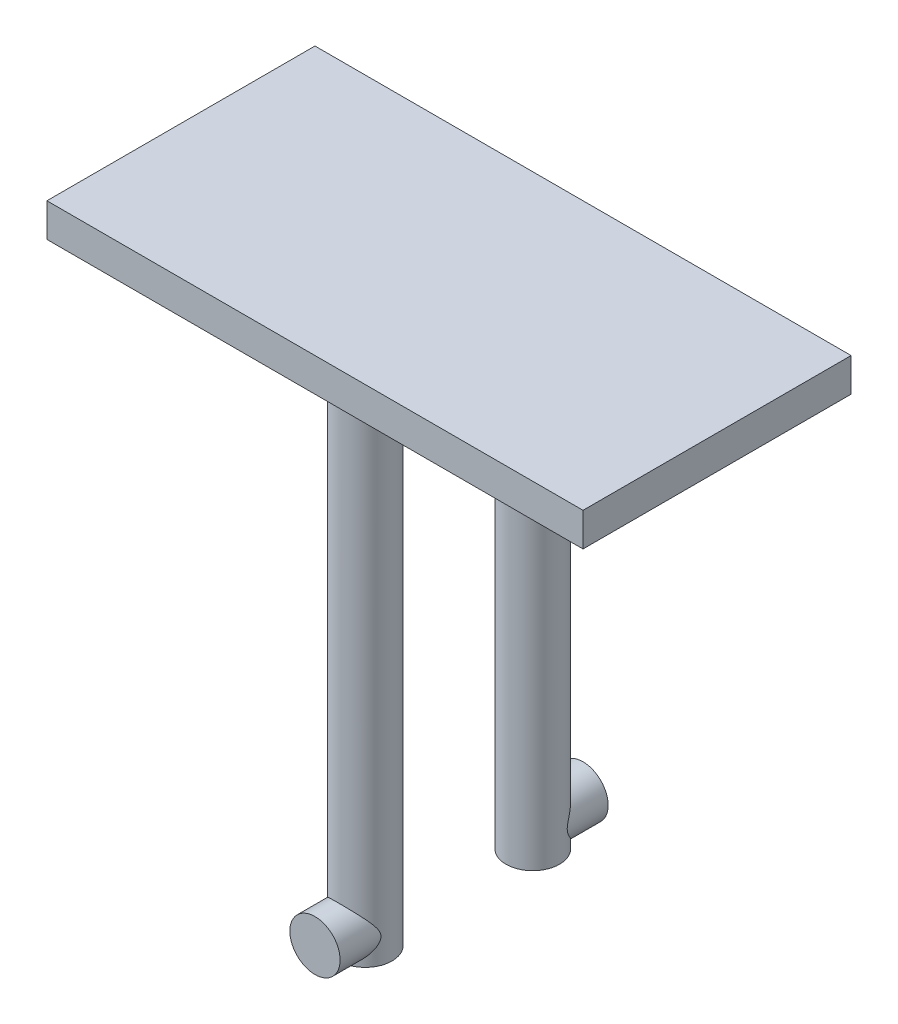
ISO-10303-21;
HEADER;
FILE_DESCRIPTION(('STEP AP214'),'2;1');
FILE_NAME('part.step','',(''),(''),'','','');
FILE_SCHEMA(('AUTOMOTIVE_DESIGN { 1 0 10303 214 1 1 1 1 }'));
ENDSEC;
DATA;
#1=APPLICATION_CONTEXT('core data for automotive mechanical design processes');
#2=APPLICATION_PROTOCOL_DEFINITION('international standard','automotive_design',2000,#1);
#3=PRODUCT_CONTEXT('',#1,'mechanical');
#4=PRODUCT('Part','Part','',(#3));
#5=PRODUCT_RELATED_PRODUCT_CATEGORY('part','',(#4));
#6=PRODUCT_DEFINITION_FORMATION('','',#4);
#7=PRODUCT_DEFINITION_CONTEXT('part definition',#1,'design');
#8=PRODUCT_DEFINITION('design','',#6,#7);
#9=PRODUCT_DEFINITION_SHAPE('','',#8);
#10=(LENGTH_UNIT() NAMED_UNIT(*) SI_UNIT(.MILLI.,.METRE.));
#11=(NAMED_UNIT(*) PLANE_ANGLE_UNIT() SI_UNIT($,.RADIAN.));
#12=(NAMED_UNIT(*) SI_UNIT($,.STERADIAN.) SOLID_ANGLE_UNIT());
#13=UNCERTAINTY_MEASURE_WITH_UNIT(LENGTH_MEASURE(1.E-05),#10,'distance_accuracy_value','');
#14=(GEOMETRIC_REPRESENTATION_CONTEXT(3) GLOBAL_UNCERTAINTY_ASSIGNED_CONTEXT((#13)) GLOBAL_UNIT_ASSIGNED_CONTEXT((#10,
#11,#12)) REPRESENTATION_CONTEXT('',''));
#15=CARTESIAN_POINT('',(0.,0.,0.));
#16=DIRECTION('',(0.,0.,1.));
#17=DIRECTION('',(1.,0.,0.));
#18=AXIS2_PLACEMENT_3D('',#15,#16,#17);
#19=CARTESIAN_POINT('',(80.,10.,-40.));
#20=DIRECTION('',(-1.,0.,0.));
#21=DIRECTION('',(0.,0.,1.));
#22=AXIS2_PLACEMENT_3D('',#19,#20,#21);
#23=PLANE('',#22);
#24=DIRECTION('',(0.,0.,-1.));
#25=VECTOR('',#24,1.);
#26=CARTESIAN_POINT('',(80.,0.,-40.));
#27=LINE('',#26,#25);
#28=CARTESIAN_POINT('',(80.,0.,40.));
#29=VERTEX_POINT('',#28);
#30=CARTESIAN_POINT('',(80.,0.,-40.));
#31=VERTEX_POINT('',#30);
#32=EDGE_CURVE('E103',#29,#31,#27,.T.);
#33=ORIENTED_EDGE('',*,*,#32,.T.);
#34=DIRECTION('',(0.,-1.,0.));
#35=VECTOR('',#34,1.);
#36=CARTESIAN_POINT('',(80.,10.,-40.));
#37=LINE('',#36,#35);
#38=CARTESIAN_POINT('',(80.,10.,-40.));
#39=VERTEX_POINT('',#38);
#40=EDGE_CURVE('E84',#39,#31,#37,.T.);
#41=ORIENTED_EDGE('',*,*,#40,.F.);
#42=DIRECTION('',(0.,0.,-1.));
#43=VECTOR('',#42,1.);
#44=CARTESIAN_POINT('',(80.,10.,-40.));
#45=LINE('',#44,#43);
#46=CARTESIAN_POINT('',(80.,10.,40.));
#47=VERTEX_POINT('',#46);
#48=EDGE_CURVE('E91',#47,#39,#45,.T.);
#49=ORIENTED_EDGE('',*,*,#48,.F.);
#50=DIRECTION('',(0.,-1.,0.));
#51=VECTOR('',#50,1.);
#52=CARTESIAN_POINT('',(80.,10.,40.));
#53=LINE('',#52,#51);
#54=EDGE_CURVE('E111',#47,#29,#53,.T.);
#55=ORIENTED_EDGE('',*,*,#54,.T.);
#56=EDGE_LOOP('',(#33,#41,#49,#55));
#57=FACE_BOUND('',#56,.T.);
#58=ADVANCED_FACE('F36',(#57),#23,.F.);
#59=CARTESIAN_POINT('',(-80.,10.,-40.));
#60=DIRECTION('',(0.,0.,1.));
#61=DIRECTION('',(1.,0.,0.));
#62=AXIS2_PLACEMENT_3D('',#59,#60,#61);
#63=PLANE('',#62);
#64=DIRECTION('',(-1.,0.,0.));
#65=VECTOR('',#64,1.);
#66=CARTESIAN_POINT('',(-80.,0.,-40.));
#67=LINE('',#66,#65);
#68=CARTESIAN_POINT('',(-80.,0.,-40.));
#69=VERTEX_POINT('',#68);
#70=EDGE_CURVE('E116',#31,#69,#67,.T.);
#71=ORIENTED_EDGE('',*,*,#70,.T.);
#72=DIRECTION('',(0.,-1.,0.));
#73=VECTOR('',#72,1.);
#74=CARTESIAN_POINT('',(-80.,10.,-40.));
#75=LINE('',#74,#73);
#76=CARTESIAN_POINT('',(-80.,10.,-40.));
#77=VERTEX_POINT('',#76);
#78=EDGE_CURVE('E87',#77,#69,#75,.T.);
#79=ORIENTED_EDGE('',*,*,#78,.F.);
#80=DIRECTION('',(-1.,0.,0.));
#81=VECTOR('',#80,1.);
#82=CARTESIAN_POINT('',(-80.,10.,-40.));
#83=LINE('',#82,#81);
#84=EDGE_CURVE('E80',#39,#77,#83,.T.);
#85=ORIENTED_EDGE('',*,*,#84,.F.);
#86=ORIENTED_EDGE('',*,*,#40,.T.);
#87=EDGE_LOOP('',(#71,#79,#85,#86));
#88=FACE_BOUND('',#87,.T.);
#89=ADVANCED_FACE('F82',(#88),#63,.F.);
#90=CARTESIAN_POINT('',(-80.,10.,-40.));
#91=DIRECTION('',(1.,0.,0.));
#92=DIRECTION('',(0.,0.,-1.));
#93=AXIS2_PLACEMENT_3D('',#90,#91,#92);
#94=PLANE('',#93);
#95=DIRECTION('',(0.,0.,1.));
#96=VECTOR('',#95,1.);
#97=CARTESIAN_POINT('',(-80.,0.,-40.));
#98=LINE('',#97,#96);
#99=CARTESIAN_POINT('',(-80.,0.,40.));
#100=VERTEX_POINT('',#99);
#101=EDGE_CURVE('E114',#69,#100,#98,.T.);
#102=ORIENTED_EDGE('',*,*,#101,.T.);
#103=DIRECTION('',(0.,-1.,0.));
#104=VECTOR('',#103,1.);
#105=CARTESIAN_POINT('',(-80.,10.,40.));
#106=LINE('',#105,#104);
#107=CARTESIAN_POINT('',(-80.,10.,40.));
#108=VERTEX_POINT('',#107);
#109=EDGE_CURVE('E106',#108,#100,#106,.T.);
#110=ORIENTED_EDGE('',*,*,#109,.F.);
#111=DIRECTION('',(0.,0.,1.));
#112=VECTOR('',#111,1.);
#113=CARTESIAN_POINT('',(-80.,10.,-40.));
#114=LINE('',#113,#112);
#115=EDGE_CURVE('E90',#77,#108,#114,.T.);
#116=ORIENTED_EDGE('',*,*,#115,.F.);
#117=ORIENTED_EDGE('',*,*,#78,.T.);
#118=EDGE_LOOP('',(#102,#110,#116,#117));
#119=FACE_BOUND('',#118,.T.);
#120=ADVANCED_FACE('F158',(#119),#94,.F.);
#121=CARTESIAN_POINT('',(-80.,10.,40.));
#122=DIRECTION('',(0.,0.,-1.));
#123=DIRECTION('',(-1.,0.,0.));
#124=AXIS2_PLACEMENT_3D('',#121,#122,#123);
#125=PLANE('',#124);
#126=DIRECTION('',(1.,0.,0.));
#127=VECTOR('',#126,1.);
#128=CARTESIAN_POINT('',(-80.,0.,40.));
#129=LINE('',#128,#127);
#130=EDGE_CURVE('E100',#100,#29,#129,.T.);
#131=ORIENTED_EDGE('',*,*,#130,.T.);
#132=ORIENTED_EDGE('',*,*,#54,.F.);
#133=DIRECTION('',(1.,0.,0.));
#134=VECTOR('',#133,1.);
#135=CARTESIAN_POINT('',(-80.,10.,40.));
#136=LINE('',#135,#134);
#137=EDGE_CURVE('E96',#108,#47,#136,.T.);
#138=ORIENTED_EDGE('',*,*,#137,.F.);
#139=ORIENTED_EDGE('',*,*,#109,.T.);
#140=EDGE_LOOP('',(#131,#132,#138,#139));
#141=FACE_BOUND('',#140,.T.);
#142=ADVANCED_FACE('F162',(#141),#125,.F.);
#143=CARTESIAN_POINT('',(0.,10.,0.));
#144=DIRECTION('',(0.,1.,0.));
#145=DIRECTION('',(0.,0.,1.));
#146=AXIS2_PLACEMENT_3D('',#143,#144,#145);
#147=PLANE('',#146);
#148=ORIENTED_EDGE('',*,*,#48,.T.);
#149=ORIENTED_EDGE('',*,*,#84,.T.);
#150=ORIENTED_EDGE('',*,*,#115,.T.);
#151=ORIENTED_EDGE('',*,*,#137,.T.);
#152=EDGE_LOOP('',(#148,#149,#150,#151));
#153=FACE_BOUND('',#152,.T.);
#154=ADVANCED_FACE('F94',(#153),#147,.T.);
#155=CARTESIAN_POINT('',(0.,0.,0.));
#156=DIRECTION('',(0.,1.,0.));
#157=DIRECTION('',(0.,0.,1.));
#158=AXIS2_PLACEMENT_3D('',#155,#156,#157);
#159=PLANE('',#158);
#160=CARTESIAN_POINT('',(0.,0.,-25.));
#161=DIRECTION('',(0.,1.,0.));
#162=DIRECTION('',(0.,0.,1.));
#163=AXIS2_PLACEMENT_3D('',#160,#161,#162);
#164=CIRCLE('',#163,8.);
#165=CARTESIAN_POINT('',(0.,0.,-17.));
#166=VERTEX_POINT('',#165);
#167=EDGE_CURVE('E11',#166,#166,#164,.F.);
#168=ORIENTED_EDGE('',*,*,#167,.F.);
#169=EDGE_LOOP('',(#168));
#170=FACE_BOUND('',#169,.T.);
#171=CARTESIAN_POINT('',(0.,0.,25.));
#172=DIRECTION('',(0.,1.,0.));
#173=DIRECTION('',(0.,0.,1.));
#174=AXIS2_PLACEMENT_3D('',#171,#172,#173);
#175=CIRCLE('',#174,8.);
#176=CARTESIAN_POINT('',(0.,0.,33.));
#177=VERTEX_POINT('',#176);
#178=EDGE_CURVE('E43',#177,#177,#175,.F.);
#179=ORIENTED_EDGE('',*,*,#178,.F.);
#180=EDGE_LOOP('',(#179));
#181=FACE_BOUND('',#180,.T.);
#182=ORIENTED_EDGE('',*,*,#32,.F.);
#183=ORIENTED_EDGE('',*,*,#130,.F.);
#184=ORIENTED_EDGE('',*,*,#101,.F.);
#185=ORIENTED_EDGE('',*,*,#70,.F.);
#186=EDGE_LOOP('',(#182,#183,#184,#185));
#187=FACE_BOUND('',#186,.T.);
#188=ADVANCED_FACE('F169',(#170,#181,#187),#159,.F.);
#189=CARTESIAN_POINT('',(0.,-150.,25.));
#190=DIRECTION('',(0.,1.,0.));
#191=DIRECTION('',(0.,0.,1.));
#192=AXIS2_PLACEMENT_3D('',#189,#190,#191);
#193=CYLINDRICAL_SURFACE('',#192,8.);
#194=CARTESIAN_POINT('',(0.,-150.,25.));
#195=DIRECTION('',(0.,-1.,0.));
#196=DIRECTION('',(0.,0.,-1.));
#197=AXIS2_PLACEMENT_3D('',#194,#195,#196);
#198=CIRCLE('',#197,8.);
#199=CARTESIAN_POINT('',(0.,-150.,33.));
#200=VERTEX_POINT('',#199);
#201=EDGE_CURVE('E119',#200,#200,#198,.T.);
#202=ORIENTED_EDGE('',*,*,#201,.F.);
#203=CARTESIAN_POINT('',(0.,-150.,33.));
#204=CARTESIAN_POINT('',(-0.171140155520825,-149.999998272119,32.9999982850458));
#205=CARTESIAN_POINT('',(-0.342347248985497,-149.994128646305,32.9944947988795));
#206=CARTESIAN_POINT('',(-0.683347114521549,-149.97076196862,32.9725948268906));
#207=CARTESIAN_POINT('',(-0.853138773025719,-149.953256502576,32.9561904583649));
#208=CARTESIAN_POINT('',(-1.19019573456619,-149.906917931642,32.912797669894));
#209=CARTESIAN_POINT('',(-1.35745443005386,-149.878059210714,32.8857853156874));
#210=CARTESIAN_POINT('',(-1.68785613707728,-149.809557463437,32.8217314698244));
#211=CARTESIAN_POINT('',(-1.85099711629617,-149.769909221368,32.7846851277169));
#212=CARTESIAN_POINT('',(-2.17079411127324,-149.68087612369,32.701605489567));
#213=CARTESIAN_POINT('',(-2.32749066541079,-149.631569313957,32.6556442575588));
#214=CARTESIAN_POINT('',(-2.63496048461638,-149.523785807643,32.5553412010213));
#215=CARTESIAN_POINT('',(-2.78573109174164,-149.4653050537,32.5009956685426));
#216=CARTESIAN_POINT('',(-3.22796304144843,-149.277362184919,32.3266923801874));
#217=CARTESIAN_POINT('',(-3.50976540960789,-149.135279252777,32.1953553051413));
#218=CARTESIAN_POINT('',(-3.96481935311031,-148.870060428321,31.9516768583423));
#219=CARTESIAN_POINT('',(-4.14547410363135,-148.753806771717,31.8452576963748));
#220=CARTESIAN_POINT('',(-4.49233053821419,-148.509485239982,31.6227908246038));
#221=CARTESIAN_POINT('',(-4.65853150542465,-148.381416779531,31.5067426377954));
#222=CARTESIAN_POINT('',(-4.97693745624539,-148.114571152028,31.266578717266));
#223=CARTESIAN_POINT('',(-5.12909618095085,-147.975761179716,31.1424384677119));
#224=CARTESIAN_POINT('',(-5.41904366538833,-147.688981938811,30.8882201087959));
#225=CARTESIAN_POINT('',(-5.5568338472138,-147.541013578962,30.7581425888972));
#226=CARTESIAN_POINT('',(-5.85378789401527,-147.195550308851,30.4579276518897));
#227=CARTESIAN_POINT('',(-6.00864552394552,-146.995488606865,30.2864750726651));
#228=CARTESIAN_POINT('',(-6.29643711950335,-146.582677935092,29.9402028423115));
#229=CARTESIAN_POINT('',(-6.42935480679956,-146.36991970305,29.7653807976505));
#230=CARTESIAN_POINT('',(-6.67335613960616,-145.932063986645,29.4171551733533));
#231=CARTESIAN_POINT('',(-6.78449331800713,-145.70699853996,29.2437491459062));
#232=CARTESIAN_POINT('',(-6.93503879605051,-145.358526639629,28.9893589413809));
#233=CARTESIAN_POINT('',(-6.98250888694929,-145.240614498295,28.9055530506312));
#234=CARTESIAN_POINT('',(-7.07200284027164,-145.000635363748,28.7410605873687));
#235=CARTESIAN_POINT('',(-7.11402765109283,-144.878569098742,28.6603734733847));
#236=CARTESIAN_POINT('',(-7.20792258104416,-144.580626070471,28.4728511713896));
#237=CARTESIAN_POINT('',(-7.25715355553096,-144.402486913328,28.3682302318375));
#238=CARTESIAN_POINT('',(-7.34370321290176,-144.034805876928,28.1750855738391));
#239=CARTESIAN_POINT('',(-7.38103501510306,-143.84527683153,28.0865441737346));
#240=CARTESIAN_POINT('',(-7.43550917073728,-143.493901098962,27.9525174289327));
#241=CARTESIAN_POINT('',(-7.45523472213531,-143.334484392454,27.9019085300405));
#242=CARTESIAN_POINT('',(-7.48447445524092,-143.009052241281,27.8256641879962));
#243=CARTESIAN_POINT('',(-7.49402079251789,-142.843059304319,27.7999501272768));
#244=CARTESIAN_POINT('',(-7.50188426137699,-142.50741481353,27.7788340177311));
#245=CARTESIAN_POINT('',(-7.50011165254644,-142.337744676994,27.7836742098476));
#246=CARTESIAN_POINT('',(-7.4853621565137,-142.002273933246,27.8230694415127));
#247=CARTESIAN_POINT('',(-7.47235945284239,-141.836483146771,27.8576929481359));
#248=CARTESIAN_POINT('',(-7.42919348555406,-141.446467526641,27.9684568284385));
#249=CARTESIAN_POINT('',(-7.39418323441422,-141.226117407615,28.0557926678811));
#250=CARTESIAN_POINT('',(-7.3081748826072,-140.800556432749,28.2561536401773));
#251=CARTESIAN_POINT('',(-7.25710620403007,-140.595417446781,28.3692915599902));
#252=CARTESIAN_POINT('',(-7.13528252726279,-140.178529357623,28.6206525540024));
#253=CARTESIAN_POINT('',(-7.0631075569353,-139.9680386822,28.7602413733488));
#254=CARTESIAN_POINT('',(-6.90268010104188,-139.558683043803,29.0472406351686));
#255=CARTESIAN_POINT('',(-6.81441141325337,-139.35983006593,29.1946588528606));
#256=CARTESIAN_POINT('',(-6.62186518229114,-138.971851462869,29.4924851778781));
#257=CARTESIAN_POINT('',(-6.5175638385451,-138.78274086688,29.6428974360643));
#258=CARTESIAN_POINT('',(-6.29291427830409,-138.413948909842,29.9431158333939));
#259=CARTESIAN_POINT('',(-6.1725721638724,-138.234263999215,30.0929221808131));
#260=CARTESIAN_POINT('',(-5.90256503866517,-137.866773481433,30.4042893110507));
#261=CARTESIAN_POINT('',(-5.75117050330106,-137.679956139813,30.5655251916551));
#262=CARTESIAN_POINT('',(-5.42785724636933,-137.318577039366,30.8812795416945));
#263=CARTESIAN_POINT('',(-5.25593182231051,-137.144019312498,31.0357957948665));
#264=CARTESIAN_POINT('',(-4.89167035945712,-136.80943504866,31.3345789133705));
#265=CARTESIAN_POINT('',(-4.69940009273921,-136.649364612557,31.4788764329711));
#266=CARTESIAN_POINT('',(-4.29384493963244,-136.345572126243,31.754473252282));
#267=CARTESIAN_POINT('',(-4.08057534190403,-136.201838343921,31.8857818710244));
#268=CARTESIAN_POINT('',(-3.71736388787438,-135.984040349336,32.0856638499816));
#269=CARTESIAN_POINT('',(-3.57369709729462,-135.904075219047,32.1592858388357));
#270=CARTESIAN_POINT('',(-3.27858166125046,-135.752526569671,32.299146850284));
#271=CARTESIAN_POINT('',(-3.12713541403125,-135.680940489545,32.3653881284777));
#272=CARTESIAN_POINT('',(-2.81689539120272,-135.547040857049,32.4895268092297));
#273=CARTESIAN_POINT('',(-2.65810216239986,-135.484726616064,32.5474248314277));
#274=CARTESIAN_POINT('',(-2.33391279425549,-135.370317156148,32.6538838848021));
#275=CARTESIAN_POINT('',(-2.16851989197029,-135.318216999719,32.7024494270813));
#276=CARTESIAN_POINT('',(-1.83051124178858,-135.224682590202,32.789734158282));
#277=CARTESIAN_POINT('',(-1.65784452477088,-135.183346813464,32.8283624009008));
#278=CARTESIAN_POINT('',(-1.30792804526106,-135.112769581755,32.8943661492893));
#279=CARTESIAN_POINT('',(-1.1306782902915,-135.083528106935,32.9217416735279));
#280=CARTESIAN_POINT('',(-0.773223557933605,-135.0377905749,32.9645781573073));
#281=CARTESIAN_POINT('',(-0.593020510230371,-135.021286509496,32.9800466029807));
#282=CARTESIAN_POINT('',(-0.231267296972528,-135.001378960833,32.9987064651965));
#283=CARTESIAN_POINT('',(-0.0497172978099028,-134.99797388556,33.0018993736723));
#284=CARTESIAN_POINT('',(0.290342268202129,-135.003939409162,32.9963069179308));
#285=CARTESIAN_POINT('',(0.448906462662995,-135.011772304468,32.9889632749535));
#286=CARTESIAN_POINT('',(0.764519077575326,-135.037388305773,32.964957824838));
#287=CARTESIAN_POINT('',(0.921567499295251,-135.055171403443,32.9482960254985));
#288=CARTESIAN_POINT('',(1.23303384291988,-135.100378688918,32.905968166315));
#289=CARTESIAN_POINT('',(1.38745171025486,-135.127803076472,32.8803019199156));
#290=CARTESIAN_POINT('',(1.69267596445187,-135.191842244296,32.8204246081167));
#291=CARTESIAN_POINT('',(1.84348219415302,-135.22845742371,32.78621317161));
#292=CARTESIAN_POINT('',(2.14034031843199,-135.310243937752,32.7098882191889));
#293=CARTESIAN_POINT('',(2.28640157212285,-135.355397058267,32.6677915267676));
#294=CARTESIAN_POINT('',(2.57345784627726,-135.453698585399,32.5762816314087));
#295=CARTESIAN_POINT('',(2.71445138573596,-135.506849306099,32.5268663109122));
#296=CARTESIAN_POINT('',(3.12901087062764,-135.677358252542,32.368624845));
#297=CARTESIAN_POINT('',(3.39433290795658,-135.805823172618,32.2497564553215));
#298=CARTESIAN_POINT('',(3.83449961926944,-136.050756971873,32.0243206734005));
#299=CARTESIAN_POINT('',(4.01499416931967,-136.161731905775,31.922526107079));
#300=CARTESIAN_POINT('',(4.36212684095347,-136.395445119924,31.7091958519606));
#301=CARTESIAN_POINT('',(4.52876332513601,-136.518184786557,31.5976590152478));
#302=CARTESIAN_POINT('',(4.84855908496093,-136.774303736541,31.3663613840266));
#303=CARTESIAN_POINT('',(5.00167503478432,-136.907714785795,31.2465761956218));
#304=CARTESIAN_POINT('',(5.29402133883606,-137.183635610184,31.0008168405998));
#305=CARTESIAN_POINT('',(5.43325279245396,-137.326144663462,30.8748431651745));
#306=CARTESIAN_POINT('',(5.73727461100759,-137.662724459642,30.5803858944969));
#307=CARTESIAN_POINT('',(5.89746534222561,-137.859590883398,30.4103376119264));
#308=CARTESIAN_POINT('',(6.19578116965257,-138.266098502706,30.0659875470895));
#309=CARTESIAN_POINT('',(6.33389147774072,-138.475748130929,29.8916830035584));
#310=CARTESIAN_POINT('',(6.58821391834527,-138.907218842427,29.5433152991096));
#311=CARTESIAN_POINT('',(6.70447648234283,-139.129010329967,29.3692525263198));
#312=CARTESIAN_POINT('',(6.86277012123271,-139.47209858417,29.1124845118594));
#313=CARTESIAN_POINT('',(6.91283540975761,-139.588148999154,29.0276474568836));
#314=CARTESIAN_POINT('',(7.00757281339969,-139.824164994471,28.8604597250002));
#315=CARTESIAN_POINT('',(7.05224565769897,-139.944130042663,28.7781087130545));
#316=CARTESIAN_POINT('',(7.15400936672737,-140.240747025563,28.5828546324688));
#317=CARTESIAN_POINT('',(7.20824885408844,-140.419715646329,28.4719342890527));
#318=CARTESIAN_POINT('',(7.30470904986911,-140.788971535612,28.264092202661));
#319=CARTESIAN_POINT('',(7.34693195161842,-140.979256730893,28.167167906647));
#320=CARTESIAN_POINT('',(7.41130464140057,-141.338259105935,28.0130184320124));
#321=CARTESIAN_POINT('',(7.43568780758691,-141.504803222509,27.9517996684319));
#322=CARTESIAN_POINT('',(7.4734059797564,-141.846280540405,27.8549999205378));
#323=CARTESIAN_POINT('',(7.48678237918467,-142.02117966928,27.8193229469561));
#324=CARTESIAN_POINT('',(7.4975349981068,-142.287656447383,27.790526340315));
#325=CARTESIAN_POINT('',(7.49954839266821,-142.37779596547,27.7850966480522));
#326=CARTESIAN_POINT('',(7.5003150760662,-142.558204650503,27.7830355318242));
#327=CARTESIAN_POINT('',(7.49906849521789,-142.648473812123,27.7864037561687));
#328=CARTESIAN_POINT('',(7.49335239350738,-142.828302800311,27.8017368892051));
#329=CARTESIAN_POINT('',(7.48887783058131,-142.917861295305,27.8137152467018));
#330=CARTESIAN_POINT('',(7.47686021888205,-143.09539319156,27.8454971259205));
#331=CARTESIAN_POINT('',(7.46931499338786,-143.183365422061,27.8653061983676));
#332=CARTESIAN_POINT('',(7.4374937229534,-143.491515596448,27.9474763982891));
#333=CARTESIAN_POINT('',(7.40537544689376,-143.706039153135,28.0283063468641));
#334=CARTESIAN_POINT('',(7.34585510094254,-144.016462025451,28.1687627812616));
#335=CARTESIAN_POINT('',(7.32405525130435,-144.118284256263,28.2189341185689));
#336=CARTESIAN_POINT('',(7.27690870119884,-144.318553198219,28.3241425027732));
#337=CARTESIAN_POINT('',(7.25156305594836,-144.417000902798,28.379178100295));
#338=CARTESIAN_POINT('',(7.16546468376637,-144.725912700971,28.5601843928537));
#339=CARTESIAN_POINT('',(7.09838559269622,-144.930676618153,28.692834235424));
#340=CARTESIAN_POINT('',(6.94924363137078,-145.328991912018,28.9664159569101));
#341=CARTESIAN_POINT('',(6.86716532401023,-145.522531463785,29.1073562660405));
#342=CARTESIAN_POINT('',(6.68816029667166,-145.90032984066,29.3928288731163));
#343=CARTESIAN_POINT('',(6.59121271670382,-146.084575136732,29.5373659745518));
#344=CARTESIAN_POINT('',(6.3824982862948,-146.444224424595,29.8265446822987));
#345=CARTESIAN_POINT('',(6.27073721143312,-146.619631825561,29.9711862261414));
#346=CARTESIAN_POINT('',(6.01804298327637,-146.98190769374,30.2750990993803));
#347=CARTESIAN_POINT('',(5.87522517290082,-147.167701739348,30.4340928756123));
#348=CARTESIAN_POINT('',(5.57010855191249,-147.527881581216,30.7464409202761));
#349=CARTESIAN_POINT('',(5.40780369388395,-147.702263809971,30.8997934186622));
#350=CARTESIAN_POINT('',(5.06375545857861,-148.037682624772,31.197580234356));
#351=CARTESIAN_POINT('',(4.88207104588726,-148.19875718878,31.3420396076404));
#352=CARTESIAN_POINT('',(4.49850655345252,-148.506146224376,31.6196255596878));
#353=CARTESIAN_POINT('',(4.29662811975492,-148.652461897034,31.7527530604945));
#354=CARTESIAN_POINT('',(3.94617023977423,-148.880051695463,31.9608721744787));
#355=CARTESIAN_POINT('',(3.80329272488273,-148.966324214585,32.0400510239986));
#356=CARTESIAN_POINT('',(3.50918494994512,-149.130533052092,32.1911706475436));
#357=CARTESIAN_POINT('',(3.35795715157176,-149.208471807593,32.263113537277));
#358=CARTESIAN_POINT('',(3.04753891383844,-149.355068296826,32.3987287813372));
#359=CARTESIAN_POINT('',(2.88835051989274,-149.423728398021,32.4624032452027));
#360=CARTESIAN_POINT('',(2.56259105089655,-149.55079255966,32.5804434267793));
#361=CARTESIAN_POINT('',(2.39602108488436,-149.609198154284,32.6348105369371));
#362=CARTESIAN_POINT('',(2.07858496131487,-149.707869939644,32.7267789760264));
#363=CARTESIAN_POINT('',(1.92851057228643,-149.749509116272,32.7656427591525));
#364=CARTESIAN_POINT('',(1.62422994160168,-149.823686650104,32.83493527005));
#365=CARTESIAN_POINT('',(1.47002442418205,-149.856226591221,32.8653654658554));
#366=CARTESIAN_POINT('',(1.15876343030753,-149.911626148063,32.9172032264867));
#367=CARTESIAN_POINT('',(1.00171529094817,-149.934507766505,32.9386312986048));
#368=CARTESIAN_POINT('',(0.685562448646796,-149.970293267319,32.9721541583853));
#369=CARTESIAN_POINT('',(0.526459059564788,-149.983203231661,32.9842546351806));
#370=CARTESIAN_POINT('',(0.305870260070787,-149.994010182016,32.994384776172));
#371=CARTESIAN_POINT('',(0.244741991429232,-149.996255321588,32.9964894513497));
#372=CARTESIAN_POINT('',(0.122412006676373,-149.999250603249,32.999297429633));
#373=CARTESIAN_POINT('',(0.0612102847531968,-150.000000617997,33.0000006133735));
#374=CARTESIAN_POINT('',(0.,-150.,33.));
#375=B_SPLINE_CURVE_WITH_KNOTS('',3,(#203,#204,#205,#206,#207,#208,#209,#210,#211,#212,#213,
#214,#215,#216,#217,#218,#219,#220,#221,#222,#223,#224,#225,#226,#227,#228,#229,#230,#231,#232,
#233,#234,#235,#236,#237,#238,#239,#240,#241,#242,#243,#244,#245,#246,#247,#248,#249,#250,#251,
#252,#253,#254,#255,#256,#257,#258,#259,#260,#261,#262,#263,#264,#265,#266,#267,#268,#269,#270,
#271,#272,#273,#274,#275,#276,#277,#278,#279,#280,#281,#282,#283,#284,#285,#286,#287,#288,#289,
#290,#291,#292,#293,#294,#295,#296,#297,#298,#299,#300,#301,#302,#303,#304,#305,#306,#307,#308,
#309,#310,#311,#312,#313,#314,#315,#316,#317,#318,#319,#320,#321,#322,#323,#324,#325,#326,#327,
#328,#329,#330,#331,#332,#333,#334,#335,#336,#337,#338,#339,#340,#341,#342,#343,#344,#345,#346,
#347,#348,#349,#350,#351,#352,#353,#354,#355,#356,#357,#358,#359,#360,#361,#362,#363,#364,#365,
#366,#367,#368,#369,#370,#371,#372,#373,#374),.UNSPECIFIED.,.T.,.F.,(4,2,2,2,2,2,2,2,2,2,2,2,2,
2,2,2,2,2,2,2,2,2,2,2,2,2,2,2,2,2,2,2,2,2,2,2,2,2,2,2,2,2,2,2,2,2,2,2,2,2,2,2,2,2,2,2,2,2,2,2,2,
2,2,2,2,2,2,2,2,2,2,2,2,2,2,2,2,2,2,2,2,2,2,2,2,4),(0.,0.513349414048379,1.02707044856066,
1.54195728739489,2.05709346921709,2.56822710716667,3.07958744494843,4.10096674642993,
4.81936320345018,5.5377952698404,6.2585153379721,6.97916400665639,7.894825025205,
8.81116239369941,9.72521850501747,10.1818214174127,10.6383446966467,11.2746288772747,
11.9102090826509,12.4137362357342,12.9156680190914,13.4215842006993,13.928666520253,
14.6434118886317,15.3613435855803,16.1482501048418,16.9359532547821,17.7248372536914,
18.5134220054786,19.3809639820929,20.2487899537545,21.1138914513758,21.9783677006139,
22.518379880179,23.0582265727522,23.5980331511237,24.1375781396025,24.681898217183,
25.2262174013776,25.7701940849939,26.3141046531654,26.7903023841722,27.2664997166428,
27.7427069156224,28.2189347993057,28.6941579727949,29.1695189161158,30.119676329879,
30.8240329459925,31.5284726675343,32.2350934866473,32.9416583102534,33.8569453482243,
34.7728428446545,35.6865994687175,36.1431326939669,36.5996041161358,37.2511433770759,
37.9025636392994,38.4382688377135,38.9719500667524,39.2424871626349,39.5130134441627,
39.7839632015053,40.0551053642932,40.7450073464959,41.0917069308757,41.4383035572428,
42.196178950241,42.9548387825923,43.7145728362169,44.4740115464549,45.3226684420348,
46.1715893853637,47.0179973346746,47.8643363481009,48.4180841490928,48.9716695672572,
49.5251134694824,50.0784745000382,50.5595345765539,51.040510862307,51.5203854391412,
51.9999670964094,52.1835569022218,52.367162343716),.UNSPECIFIED.);
#376=EDGE_CURVE('E48',#200,#200,#375,.T.);
#377=ORIENTED_EDGE('',*,*,#376,.T.);
#378=EDGE_LOOP('',(#202,#377));
#379=FACE_BOUND('',#378,.T.);
#380=ORIENTED_EDGE('',*,*,#178,.T.);
#381=EDGE_LOOP('',(#380));
#382=FACE_BOUND('',#381,.T.);
#383=ADVANCED_FACE('F172',(#379,#382),#193,.T.);
#384=CARTESIAN_POINT('',(0.,-150.,25.));
#385=DIRECTION('',(0.,-1.,0.));
#386=DIRECTION('',(0.,0.,-1.));
#387=AXIS2_PLACEMENT_3D('',#384,#385,#386);
#388=PLANE('',#387);
#389=ORIENTED_EDGE('',*,*,#201,.T.);
#390=EDGE_LOOP('',(#389));
#391=FACE_BOUND('',#390,.T.);
#392=ADVANCED_FACE('F152',(#391),#388,.T.);
#393=CARTESIAN_POINT('',(0.,-150.,-25.));
#394=DIRECTION('',(0.,1.,0.));
#395=DIRECTION('',(0.,0.,1.));
#396=AXIS2_PLACEMENT_3D('',#393,#394,#395);
#397=CYLINDRICAL_SURFACE('',#396,8.);
#398=CARTESIAN_POINT('',(0.,-150.,-25.));
#399=DIRECTION('',(0.,-1.,0.));
#400=DIRECTION('',(0.,0.,1.));
#401=AXIS2_PLACEMENT_3D('',#398,#399,#400);
#402=CIRCLE('',#401,8.);
#403=CARTESIAN_POINT('',(0.,-150.,-33.));
#404=VERTEX_POINT('',#403);
#405=EDGE_CURVE('E124',#404,#404,#402,.T.);
#406=ORIENTED_EDGE('',*,*,#405,.F.);
#407=CARTESIAN_POINT('',(0.,-150.,-33.));
#408=CARTESIAN_POINT('',(0.171140155520824,-149.999998272119,-32.9999982850458));
#409=CARTESIAN_POINT('',(0.342347248985495,-149.994128646305,-32.9944947988795));
#410=CARTESIAN_POINT('',(0.683347114521548,-149.97076196862,-32.9725948268906));
#411=CARTESIAN_POINT('',(0.85313877302572,-149.953256502576,-32.9561904583649));
#412=CARTESIAN_POINT('',(1.19019573456619,-149.906917931642,-32.912797669894));
#413=CARTESIAN_POINT('',(1.35745443005386,-149.878059210714,-32.8857853156874));
#414=CARTESIAN_POINT('',(1.68785613707728,-149.809557463437,-32.8217314698244));
#415=CARTESIAN_POINT('',(1.85099711629616,-149.769909221368,-32.7846851277169));
#416=CARTESIAN_POINT('',(2.17079411127324,-149.68087612369,-32.701605489567));
#417=CARTESIAN_POINT('',(2.32749066541079,-149.631569313957,-32.6556442575588));
#418=CARTESIAN_POINT('',(2.63496048461638,-149.523785807643,-32.5553412010213));
#419=CARTESIAN_POINT('',(2.78573109174164,-149.4653050537,-32.5009956685426));
#420=CARTESIAN_POINT('',(3.22796304144844,-149.277362184919,-32.3266923801874));
#421=CARTESIAN_POINT('',(3.50976540960789,-149.135279252777,-32.1953553051413));
#422=CARTESIAN_POINT('',(3.96481935311031,-148.870060428321,-31.9516768583423));
#423=CARTESIAN_POINT('',(4.14547410363135,-148.753806771717,-31.8452576963748));
#424=CARTESIAN_POINT('',(4.49233053821419,-148.509485239982,-31.6227908246038));
#425=CARTESIAN_POINT('',(4.65853150542466,-148.381416779531,-31.5067426377954));
#426=CARTESIAN_POINT('',(4.97693745624539,-148.114571152028,-31.266578717266));
#427=CARTESIAN_POINT('',(5.12909618095085,-147.975761179716,-31.1424384677119));
#428=CARTESIAN_POINT('',(5.41904366538833,-147.688981938811,-30.8882201087959));
#429=CARTESIAN_POINT('',(5.5568338472138,-147.541013578962,-30.7581425888972));
#430=CARTESIAN_POINT('',(5.85378789401527,-147.195550308851,-30.4579276518897));
#431=CARTESIAN_POINT('',(6.00864552394552,-146.995488606865,-30.2864750726651));
#432=CARTESIAN_POINT('',(6.29643711950335,-146.582677935092,-29.9402028423115));
#433=CARTESIAN_POINT('',(6.42935480679955,-146.36991970305,-29.7653807976505));
#434=CARTESIAN_POINT('',(6.67335613960616,-145.932063986645,-29.4171551733533));
#435=CARTESIAN_POINT('',(6.78449331800713,-145.70699853996,-29.2437491459062));
#436=CARTESIAN_POINT('',(6.93503879605051,-145.358526639629,-28.9893589413809));
#437=CARTESIAN_POINT('',(6.98250888694929,-145.240614498295,-28.9055530506312));
#438=CARTESIAN_POINT('',(7.07200284027165,-145.000635363748,-28.7410605873687));
#439=CARTESIAN_POINT('',(7.11402765109283,-144.878569098742,-28.6603734733847));
#440=CARTESIAN_POINT('',(7.20792258104416,-144.580626070471,-28.4728511713896));
#441=CARTESIAN_POINT('',(7.25715355553096,-144.402486913328,-28.3682302318375));
#442=CARTESIAN_POINT('',(7.34370321290176,-144.034805876928,-28.1750855738391));
#443=CARTESIAN_POINT('',(7.38103501510306,-143.84527683153,-28.0865441737346));
#444=CARTESIAN_POINT('',(7.43550917073728,-143.493901098962,-27.9525174289327));
#445=CARTESIAN_POINT('',(7.45523472213531,-143.334484392454,-27.9019085300405));
#446=CARTESIAN_POINT('',(7.48447445524092,-143.009052241281,-27.8256641879962));
#447=CARTESIAN_POINT('',(7.49402079251789,-142.843059304319,-27.7999501272768));
#448=CARTESIAN_POINT('',(7.50188426137699,-142.50741481353,-27.7788340177311));
#449=CARTESIAN_POINT('',(7.50011165254644,-142.337744676994,-27.7836742098476));
#450=CARTESIAN_POINT('',(7.4853621565137,-142.002273933246,-27.8230694415127));
#451=CARTESIAN_POINT('',(7.47235945284239,-141.836483146771,-27.8576929481359));
#452=CARTESIAN_POINT('',(7.42919348555406,-141.446467526641,-27.9684568284385));
#453=CARTESIAN_POINT('',(7.39418323441422,-141.226117407615,-28.0557926678811));
#454=CARTESIAN_POINT('',(7.3081748826072,-140.800556432749,-28.2561536401773));
#455=CARTESIAN_POINT('',(7.25710620403007,-140.595417446781,-28.3692915599902));
#456=CARTESIAN_POINT('',(7.13528252726279,-140.178529357623,-28.6206525540024));
#457=CARTESIAN_POINT('',(7.0631075569353,-139.9680386822,-28.7602413733488));
#458=CARTESIAN_POINT('',(6.90268010104188,-139.558683043803,-29.0472406351686));
#459=CARTESIAN_POINT('',(6.81441141325337,-139.35983006593,-29.1946588528606));
#460=CARTESIAN_POINT('',(6.62186518229114,-138.971851462869,-29.4924851778781));
#461=CARTESIAN_POINT('',(6.5175638385451,-138.78274086688,-29.6428974360643));
#462=CARTESIAN_POINT('',(6.29291427830409,-138.413948909842,-29.9431158333938));
#463=CARTESIAN_POINT('',(6.17257216387241,-138.234263999215,-30.0929221808131));
#464=CARTESIAN_POINT('',(5.90256503866518,-137.866773481433,-30.4042893110507));
#465=CARTESIAN_POINT('',(5.75117050330106,-137.679956139813,-30.5655251916551));
#466=CARTESIAN_POINT('',(5.42785724636934,-137.318577039366,-30.8812795416945));
#467=CARTESIAN_POINT('',(5.25593182231052,-137.144019312498,-31.0357957948664));
#468=CARTESIAN_POINT('',(4.89167035945713,-136.80943504866,-31.3345789133705));
#469=CARTESIAN_POINT('',(4.69940009273922,-136.649364612557,-31.4788764329711));
#470=CARTESIAN_POINT('',(4.29384493963245,-136.345572126243,-31.754473252282));
#471=CARTESIAN_POINT('',(4.08057534190404,-136.201838343921,-31.8857818710244));
#472=CARTESIAN_POINT('',(3.71736388787439,-135.984040349336,-32.0856638499816));
#473=CARTESIAN_POINT('',(3.57369709729463,-135.904075219047,-32.1592858388357));
#474=CARTESIAN_POINT('',(3.27858166125047,-135.752526569671,-32.299146850284));
#475=CARTESIAN_POINT('',(3.12713541403125,-135.680940489545,-32.3653881284777));
#476=CARTESIAN_POINT('',(2.81689539120271,-135.547040857049,-32.4895268092297));
#477=CARTESIAN_POINT('',(2.65810216239984,-135.484726616064,-32.5474248314277));
#478=CARTESIAN_POINT('',(2.33391279425549,-135.370317156148,-32.6538838848021));
#479=CARTESIAN_POINT('',(2.16851989197029,-135.318216999719,-32.7024494270813));
#480=CARTESIAN_POINT('',(1.83051124178859,-135.224682590202,-32.789734158282));
#481=CARTESIAN_POINT('',(1.65784452477088,-135.183346813464,-32.8283624009008));
#482=CARTESIAN_POINT('',(1.30792804526106,-135.112769581755,-32.8943661492893));
#483=CARTESIAN_POINT('',(1.1306782902915,-135.083528106935,-32.9217416735279));
#484=CARTESIAN_POINT('',(0.773223557933608,-135.0377905749,-32.9645781573073));
#485=CARTESIAN_POINT('',(0.593020510230372,-135.021286509496,-32.9800466029807));
#486=CARTESIAN_POINT('',(0.231267296972528,-135.001378960833,-32.9987064651965));
#487=CARTESIAN_POINT('',(0.0497172978099022,-134.99797388556,-33.0018993736723));
#488=CARTESIAN_POINT('',(-0.29034226820213,-135.003939409162,-32.9963069179308));
#489=CARTESIAN_POINT('',(-0.448906462662995,-135.011772304468,-32.9889632749535));
#490=CARTESIAN_POINT('',(-0.764519077575326,-135.037388305773,-32.964957824838));
#491=CARTESIAN_POINT('',(-0.921567499295251,-135.055171403443,-32.9482960254985));
#492=CARTESIAN_POINT('',(-1.23303384291988,-135.100378688918,-32.905968166315));
#493=CARTESIAN_POINT('',(-1.38745171025486,-135.127803076472,-32.8803019199156));
#494=CARTESIAN_POINT('',(-1.69267596445188,-135.191842244296,-32.8204246081167));
#495=CARTESIAN_POINT('',(-1.84348219415302,-135.22845742371,-32.78621317161));
#496=CARTESIAN_POINT('',(-2.14034031843199,-135.310243937752,-32.7098882191889));
#497=CARTESIAN_POINT('',(-2.28640157212285,-135.355397058267,-32.6677915267676));
#498=CARTESIAN_POINT('',(-2.57345784627726,-135.453698585399,-32.5762816314087));
#499=CARTESIAN_POINT('',(-2.71445138573596,-135.506849306099,-32.5268663109122));
#500=CARTESIAN_POINT('',(-3.12901087062764,-135.677358252542,-32.368624845));
#501=CARTESIAN_POINT('',(-3.39433290795657,-135.805823172618,-32.2497564553215));
#502=CARTESIAN_POINT('',(-3.83449961926944,-136.050756971873,-32.0243206734005));
#503=CARTESIAN_POINT('',(-4.01499416931967,-136.161731905775,-31.922526107079));
#504=CARTESIAN_POINT('',(-4.36212684095347,-136.395445119924,-31.7091958519606));
#505=CARTESIAN_POINT('',(-4.52876332513602,-136.518184786557,-31.5976590152478));
#506=CARTESIAN_POINT('',(-4.84855908496094,-136.774303736541,-31.3663613840266));
#507=CARTESIAN_POINT('',(-5.00167503478433,-136.907714785795,-31.2465761956218));
#508=CARTESIAN_POINT('',(-5.29402133883607,-137.183635610184,-31.0008168405997));
#509=CARTESIAN_POINT('',(-5.43325279245397,-137.326144663462,-30.8748431651745));
#510=CARTESIAN_POINT('',(-5.7372746110076,-137.662724459642,-30.5803858944969));
#511=CARTESIAN_POINT('',(-5.89746534222561,-137.859590883398,-30.4103376119264));
#512=CARTESIAN_POINT('',(-6.19578116965257,-138.266098502706,-30.0659875470895));
#513=CARTESIAN_POINT('',(-6.33389147774072,-138.475748130929,-29.8916830035584));
#514=CARTESIAN_POINT('',(-6.58821391834527,-138.907218842427,-29.5433152991096));
#515=CARTESIAN_POINT('',(-6.70447648234282,-139.129010329967,-29.3692525263198));
#516=CARTESIAN_POINT('',(-6.86277012123271,-139.47209858417,-29.1124845118594));
#517=CARTESIAN_POINT('',(-6.91283540975762,-139.588148999154,-29.0276474568836));
#518=CARTESIAN_POINT('',(-7.0075728133997,-139.824164994471,-28.8604597250002));
#519=CARTESIAN_POINT('',(-7.05224565769897,-139.944130042663,-28.7781087130545));
#520=CARTESIAN_POINT('',(-7.15400936672736,-140.240747025563,-28.5828546324688));
#521=CARTESIAN_POINT('',(-7.20824885408844,-140.419715646329,-28.4719342890527));
#522=CARTESIAN_POINT('',(-7.30470904986911,-140.788971535612,-28.264092202661));
#523=CARTESIAN_POINT('',(-7.34693195161842,-140.979256730893,-28.167167906647));
#524=CARTESIAN_POINT('',(-7.41130464140057,-141.338259105935,-28.0130184320124));
#525=CARTESIAN_POINT('',(-7.43568780758691,-141.504803222509,-27.9517996684319));
#526=CARTESIAN_POINT('',(-7.47340597975641,-141.846280540405,-27.8549999205378));
#527=CARTESIAN_POINT('',(-7.48678237918467,-142.02117966928,-27.819322946956));
#528=CARTESIAN_POINT('',(-7.4975349981068,-142.287656447383,-27.790526340315));
#529=CARTESIAN_POINT('',(-7.49954839266821,-142.37779596547,-27.7850966480522));
#530=CARTESIAN_POINT('',(-7.5003150760662,-142.558204650503,-27.7830355318242));
#531=CARTESIAN_POINT('',(-7.49906849521789,-142.648473812123,-27.7864037561687));
#532=CARTESIAN_POINT('',(-7.49335239350738,-142.828302800311,-27.8017368892051));
#533=CARTESIAN_POINT('',(-7.48887783058131,-142.917861295305,-27.8137152467018));
#534=CARTESIAN_POINT('',(-7.47686021888205,-143.09539319156,-27.8454971259205));
#535=CARTESIAN_POINT('',(-7.46931499338786,-143.183365422061,-27.8653061983676));
#536=CARTESIAN_POINT('',(-7.4374937229534,-143.491515596448,-27.9474763982891));
#537=CARTESIAN_POINT('',(-7.40537544689376,-143.706039153135,-28.0283063468641));
#538=CARTESIAN_POINT('',(-7.34585510094253,-144.016462025451,-28.1687627812616));
#539=CARTESIAN_POINT('',(-7.32405525130434,-144.118284256263,-28.2189341185689));
#540=CARTESIAN_POINT('',(-7.27690870119883,-144.318553198219,-28.3241425027732));
#541=CARTESIAN_POINT('',(-7.25156305594835,-144.417000902798,-28.3791781002951));
#542=CARTESIAN_POINT('',(-7.16546468376635,-144.725912700971,-28.5601843928537));
#543=CARTESIAN_POINT('',(-7.09838559269619,-144.930676618153,-28.6928342354241));
#544=CARTESIAN_POINT('',(-6.94924363137075,-145.328991912018,-28.9664159569102));
#545=CARTESIAN_POINT('',(-6.8671653240102,-145.522531463785,-29.1073562660406));
#546=CARTESIAN_POINT('',(-6.68816029667163,-145.90032984066,-29.3928288731163));
#547=CARTESIAN_POINT('',(-6.59121271670379,-146.084575136732,-29.5373659745519));
#548=CARTESIAN_POINT('',(-6.38249828629477,-146.444224424595,-29.8265446822988));
#549=CARTESIAN_POINT('',(-6.27073721143308,-146.619631825561,-29.9711862261414));
#550=CARTESIAN_POINT('',(-6.01804298327633,-146.98190769374,-30.2750990993804));
#551=CARTESIAN_POINT('',(-5.87522517290078,-147.167701739349,-30.4340928756123));
#552=CARTESIAN_POINT('',(-5.57010855191243,-147.527881581216,-30.7464409202761));
#553=CARTESIAN_POINT('',(-5.40780369388387,-147.702263809971,-30.8997934186623));
#554=CARTESIAN_POINT('',(-5.06375545857852,-148.037682624772,-31.197580234356));
#555=CARTESIAN_POINT('',(-4.88207104588717,-148.19875718878,-31.3420396076405));
#556=CARTESIAN_POINT('',(-4.49850655345242,-148.506146224376,-31.6196255596879));
#557=CARTESIAN_POINT('',(-4.2966281197548,-148.652461897034,-31.7527530604946));
#558=CARTESIAN_POINT('',(-3.94617023977411,-148.880051695463,-31.9608721744788));
#559=CARTESIAN_POINT('',(-3.8032927248826,-148.966324214585,-32.0400510239987));
#560=CARTESIAN_POINT('',(-3.50918494994499,-149.130533052092,-32.1911706475436));
#561=CARTESIAN_POINT('',(-3.35795715157163,-149.208471807593,-32.2631135372771));
#562=CARTESIAN_POINT('',(-3.04753891383832,-149.355068296826,-32.3987287813372));
#563=CARTESIAN_POINT('',(-2.88835051989262,-149.423728398021,-32.4624032452028));
#564=CARTESIAN_POINT('',(-2.56259105089644,-149.55079255966,-32.5804434267793));
#565=CARTESIAN_POINT('',(-2.39602108488425,-149.609198154284,-32.6348105369371));
#566=CARTESIAN_POINT('',(-2.07858496131476,-149.707869939644,-32.7267789760264));
#567=CARTESIAN_POINT('',(-1.92851057228633,-149.749509116272,-32.7656427591525));
#568=CARTESIAN_POINT('',(-1.62422994160157,-149.823686650104,-32.83493527005));
#569=CARTESIAN_POINT('',(-1.47002442418194,-149.856226591221,-32.8653654658554));
#570=CARTESIAN_POINT('',(-1.15876343030741,-149.911626148063,-32.9172032264867));
#571=CARTESIAN_POINT('',(-1.00171529094806,-149.934507766505,-32.9386312986049));
#572=CARTESIAN_POINT('',(-0.685562448646687,-149.970293267319,-32.9721541583853));
#573=CARTESIAN_POINT('',(-0.526459059564681,-149.983203231661,-32.9842546351806));
#574=CARTESIAN_POINT('',(-0.305870260070698,-149.994010182016,-32.994384776172));
#575=CARTESIAN_POINT('',(-0.244741991429159,-149.996255321588,-32.9964894513497));
#576=CARTESIAN_POINT('',(-0.122412006676336,-149.999250603249,-32.999297429633));
#577=CARTESIAN_POINT('',(-0.0612102847531779,-150.000000617997,-33.0000006133735));
#578=CARTESIAN_POINT('',(0.,-150.,-33.));
#579=B_SPLINE_CURVE_WITH_KNOTS('',3,(#407,#408,#409,#410,#411,#412,#413,#414,#415,#416,#417,
#418,#419,#420,#421,#422,#423,#424,#425,#426,#427,#428,#429,#430,#431,#432,#433,#434,#435,#436,
#437,#438,#439,#440,#441,#442,#443,#444,#445,#446,#447,#448,#449,#450,#451,#452,#453,#454,#455,
#456,#457,#458,#459,#460,#461,#462,#463,#464,#465,#466,#467,#468,#469,#470,#471,#472,#473,#474,
#475,#476,#477,#478,#479,#480,#481,#482,#483,#484,#485,#486,#487,#488,#489,#490,#491,#492,#493,
#494,#495,#496,#497,#498,#499,#500,#501,#502,#503,#504,#505,#506,#507,#508,#509,#510,#511,#512,
#513,#514,#515,#516,#517,#518,#519,#520,#521,#522,#523,#524,#525,#526,#527,#528,#529,#530,#531,
#532,#533,#534,#535,#536,#537,#538,#539,#540,#541,#542,#543,#544,#545,#546,#547,#548,#549,#550,
#551,#552,#553,#554,#555,#556,#557,#558,#559,#560,#561,#562,#563,#564,#565,#566,#567,#568,#569,
#570,#571,#572,#573,#574,#575,#576,#577,#578),.UNSPECIFIED.,.T.,.F.,(4,2,2,2,2,2,2,2,2,2,2,2,2,
2,2,2,2,2,2,2,2,2,2,2,2,2,2,2,2,2,2,2,2,2,2,2,2,2,2,2,2,2,2,2,2,2,2,2,2,2,2,2,2,2,2,2,2,2,2,2,2,
2,2,2,2,2,2,2,2,2,2,2,2,2,2,2,2,2,2,2,2,2,2,2,2,4),(0.,0.513349414048378,1.02707044856066,
1.54195728739488,2.0570934692171,2.56822710716668,3.07958744494843,4.10096674642994,
4.81936320345021,5.5377952698404,6.25851533797211,6.9791640066564,7.89482502520497,
8.81116239369942,9.72521850501747,10.1818214174127,10.6383446966467,11.2746288772747,
11.9102090826509,12.4137362357342,12.9156680190914,13.4215842006993,13.928666520253,
14.6434118886317,15.3613435855803,16.1482501048418,16.9359532547821,17.7248372536914,
18.5134220054786,19.3809639820929,20.2487899537545,21.1138914513757,21.9783677006139,
22.518379880179,23.0582265727522,23.5980331511237,24.1375781396025,24.681898217183,
25.2262174013776,25.7701940849939,26.3141046531654,26.7903023841722,27.2664997166428,
27.7427069156224,28.2189347993057,28.6941579727949,29.1695189161158,30.119676329879,
30.8240329459925,31.5284726675343,32.2350934866474,32.9416583102534,33.8569453482243,
34.7728428446545,35.6865994687175,36.1431326939668,36.5996041161358,37.2511433770759,
37.9025636392994,38.4382688377135,38.9719500667524,39.242487162635,39.5130134441627,
39.7839632015054,40.0551053642932,40.745007346496,41.0917069308758,41.4383035572428,
42.1961789502411,42.9548387825924,43.714572836217,44.474011546455,45.3226684420349,
46.1715893853638,47.0179973346747,47.864336348101,48.418084149093,48.9716695672574,
49.5251134694825,50.0784745000383,50.559534576554,51.0405108623072,51.5203854391413,
51.9999670964096,52.1835569022218,52.367162343716),.UNSPECIFIED.);
#580=EDGE_CURVE('E53',#404,#404,#579,.T.);
#581=ORIENTED_EDGE('',*,*,#580,.T.);
#582=EDGE_LOOP('',(#406,#581));
#583=FACE_BOUND('',#582,.T.);
#584=ORIENTED_EDGE('',*,*,#167,.T.);
#585=EDGE_LOOP('',(#584));
#586=FACE_BOUND('',#585,.T.);
#587=ADVANCED_FACE('F135',(#583,#586),#397,.T.);
#588=CARTESIAN_POINT('',(0.,-150.,-25.));
#589=DIRECTION('',(0.,1.,0.));
#590=DIRECTION('',(0.,0.,1.));
#591=AXIS2_PLACEMENT_3D('',#588,#589,#590);
#592=PLANE('',#591);
#593=ORIENTED_EDGE('',*,*,#405,.T.);
#594=EDGE_LOOP('',(#593));
#595=FACE_BOUND('',#594,.T.);
#596=ADVANCED_FACE('F144',(#595),#592,.F.);
#597=CARTESIAN_POINT('',(0.,-142.5,-25.));
#598=DIRECTION('',(0.,0.,-1.));
#599=DIRECTION('',(-1.,0.,0.));
#600=AXIS2_PLACEMENT_3D('',#597,#598,#599);
#601=CYLINDRICAL_SURFACE('',#600,7.50000000000001);
#602=CARTESIAN_POINT('',(0.,-142.5,-40.));
#603=DIRECTION('',(0.,0.,-1.));
#604=DIRECTION('',(-1.,0.,0.));
#605=AXIS2_PLACEMENT_3D('',#602,#603,#604);
#606=CIRCLE('',#605,7.50000000000001);
#607=CARTESIAN_POINT('',(-7.50000000000001,-142.5,-40.));
#608=VERTEX_POINT('',#607);
#609=EDGE_CURVE('E133',#608,#608,#606,.T.);
#610=ORIENTED_EDGE('',*,*,#609,.F.);
#611=EDGE_LOOP('',(#610));
#612=FACE_BOUND('',#611,.T.);
#613=ORIENTED_EDGE('',*,*,#580,.F.);
#614=EDGE_LOOP('',(#613));
#615=FACE_BOUND('',#614,.T.);
#616=ADVANCED_FACE('F139',(#612,#615),#601,.T.);
#617=CARTESIAN_POINT('',(0.,-142.5,-40.));
#618=DIRECTION('',(0.,0.,-1.));
#619=DIRECTION('',(-1.,0.,0.));
#620=AXIS2_PLACEMENT_3D('',#617,#618,#619);
#621=PLANE('',#620);
#622=ORIENTED_EDGE('',*,*,#609,.T.);
#623=EDGE_LOOP('',(#622));
#624=FACE_BOUND('',#623,.T.);
#625=ADVANCED_FACE('F143',(#624),#621,.T.);
#626=CARTESIAN_POINT('',(0.,-142.5,25.));
#627=DIRECTION('',(0.,0.,1.));
#628=DIRECTION('',(1.,0.,0.));
#629=AXIS2_PLACEMENT_3D('',#626,#627,#628);
#630=CYLINDRICAL_SURFACE('',#629,7.5);
#631=CARTESIAN_POINT('',(0.,-142.5,40.));
#632=DIRECTION('',(0.,0.,1.));
#633=DIRECTION('',(1.,0.,0.));
#634=AXIS2_PLACEMENT_3D('',#631,#632,#633);
#635=CIRCLE('',#634,7.5);
#636=CARTESIAN_POINT('',(7.5,-142.5,40.));
#637=VERTEX_POINT('',#636);
#638=EDGE_CURVE('E183',#637,#637,#635,.T.);
#639=ORIENTED_EDGE('',*,*,#638,.F.);
#640=EDGE_LOOP('',(#639));
#641=FACE_BOUND('',#640,.T.);
#642=ORIENTED_EDGE('',*,*,#376,.F.);
#643=EDGE_LOOP('',(#642));
#644=FACE_BOUND('',#643,.T.);
#645=ADVANCED_FACE('F184',(#641,#644),#630,.T.);
#646=CARTESIAN_POINT('',(0.,-142.5,40.));
#647=DIRECTION('',(0.,0.,1.));
#648=DIRECTION('',(1.,0.,0.));
#649=AXIS2_PLACEMENT_3D('',#646,#647,#648);
#650=PLANE('',#649);
#651=ORIENTED_EDGE('',*,*,#638,.T.);
#652=EDGE_LOOP('',(#651));
#653=FACE_BOUND('',#652,.T.);
#654=ADVANCED_FACE('F188',(#653),#650,.T.);
#655=CLOSED_SHELL('',(#58,#89,#120,#142,#154,#188,#383,#392,#587,#596,#616,#625,#645,#654));
#656=MANIFOLD_SOLID_BREP('B2',#655);
#657=ADVANCED_BREP_SHAPE_REPRESENTATION('',(#18,#656),#14);
#658=SHAPE_DEFINITION_REPRESENTATION(#9,#657);
ENDSEC;
END-ISO-10303-21;
